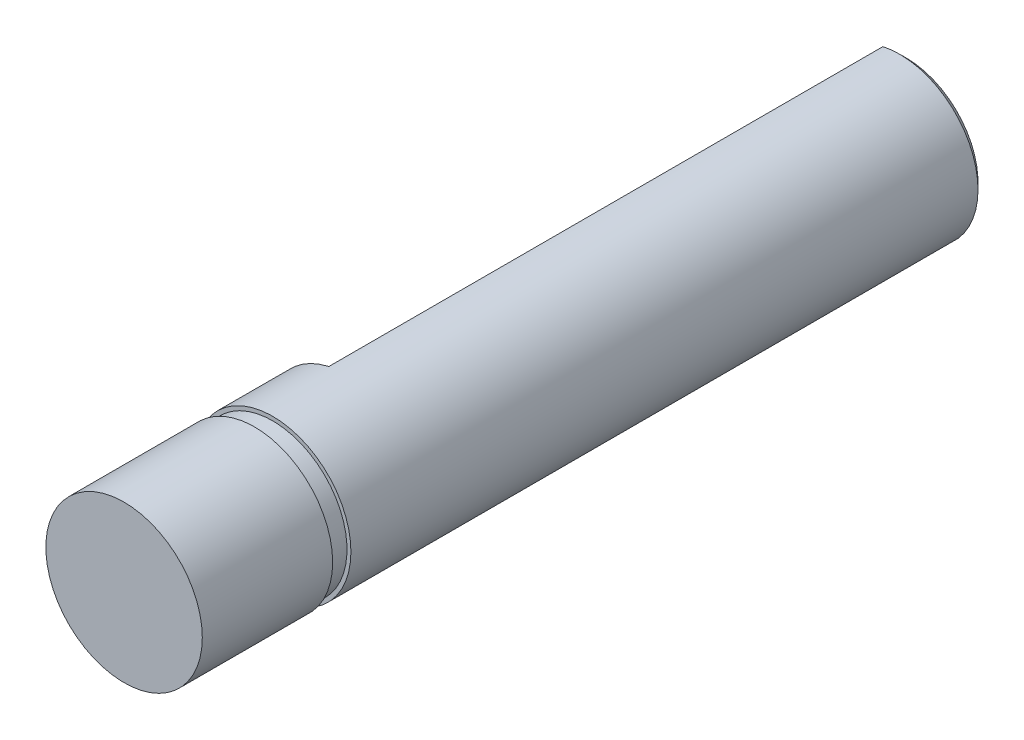
ISO-10303-21;
HEADER;
FILE_DESCRIPTION(('STEP AP214'),'2;1');
FILE_NAME('part.step','',(''),(''),'','','');
FILE_SCHEMA(('AUTOMOTIVE_DESIGN { 1 0 10303 214 1 1 1 1 }'));
ENDSEC;
DATA;
#1=APPLICATION_CONTEXT('core data for automotive mechanical design processes');
#2=APPLICATION_PROTOCOL_DEFINITION('international standard','automotive_design',2000,#1);
#3=PRODUCT_CONTEXT('',#1,'mechanical');
#4=PRODUCT('Part','Part','',(#3));
#5=PRODUCT_RELATED_PRODUCT_CATEGORY('part','',(#4));
#6=PRODUCT_DEFINITION_FORMATION('','',#4);
#7=PRODUCT_DEFINITION_CONTEXT('part definition',#1,'design');
#8=PRODUCT_DEFINITION('design','',#6,#7);
#9=PRODUCT_DEFINITION_SHAPE('','',#8);
#10=(LENGTH_UNIT() NAMED_UNIT(*) SI_UNIT(.MILLI.,.METRE.));
#11=(NAMED_UNIT(*) PLANE_ANGLE_UNIT() SI_UNIT($,.RADIAN.));
#12=(NAMED_UNIT(*) SI_UNIT($,.STERADIAN.) SOLID_ANGLE_UNIT());
#13=UNCERTAINTY_MEASURE_WITH_UNIT(LENGTH_MEASURE(1.E-05),#10,'distance_accuracy_value','');
#14=(GEOMETRIC_REPRESENTATION_CONTEXT(3) GLOBAL_UNCERTAINTY_ASSIGNED_CONTEXT((#13)) GLOBAL_UNIT_ASSIGNED_CONTEXT((#10,
#11,#12)) REPRESENTATION_CONTEXT('',''));
#15=CARTESIAN_POINT('',(0.,0.,0.));
#16=DIRECTION('',(0.,0.,1.));
#17=DIRECTION('',(1.,0.,0.));
#18=AXIS2_PLACEMENT_3D('',#15,#16,#17);
#19=CARTESIAN_POINT('',(0.,0.,-102.5));
#20=DIRECTION('',(0.,0.,-1.));
#21=DIRECTION('',(-1.,0.,0.));
#22=AXIS2_PLACEMENT_3D('',#19,#20,#21);
#23=PLANE('',#22);
#24=CARTESIAN_POINT('',(0.,0.,-102.5));
#25=DIRECTION('',(0.,0.,1.));
#26=DIRECTION('',(1.,0.,0.));
#27=AXIS2_PLACEMENT_3D('',#24,#25,#26);
#28=CIRCLE('',#27,3.);
#29=CARTESIAN_POINT('',(2.99999999999997,0.,-102.5));
#30=VERTEX_POINT('',#29);
#31=EDGE_CURVE('E20',#30,#30,#28,.F.);
#32=ORIENTED_EDGE('',*,*,#31,.F.);
#33=EDGE_LOOP('',(#32));
#34=FACE_BOUND('',#33,.T.);
#35=ADVANCED_FACE('F17',(#34),#23,.F.);
#36=CARTESIAN_POINT('',(0.,0.,-132.5));
#37=DIRECTION('',(0.,0.,1.));
#38=DIRECTION('',(1.,0.,0.));
#39=AXIS2_PLACEMENT_3D('',#36,#37,#38);
#40=CYLINDRICAL_SURFACE('',#39,3.);
#41=ORIENTED_EDGE('',*,*,#31,.T.);
#42=EDGE_LOOP('',(#41));
#43=FACE_BOUND('',#42,.T.);
#44=CARTESIAN_POINT('',(0.,0.,-107.5));
#45=DIRECTION('',(0.,0.,1.));
#46=DIRECTION('',(1.,0.,0.));
#47=AXIS2_PLACEMENT_3D('',#44,#45,#46);
#48=CIRCLE('',#47,3.);
#49=CARTESIAN_POINT('',(2.99999999999997,0.,-107.5));
#50=VERTEX_POINT('',#49);
#51=EDGE_CURVE('E62',#50,#50,#48,.T.);
#52=ORIENTED_EDGE('',*,*,#51,.T.);
#53=EDGE_LOOP('',(#52));
#54=FACE_BOUND('',#53,.T.);
#55=ADVANCED_FACE('F118',(#43,#54),#40,.T.);
#56=CARTESIAN_POINT('',(2.33031200320085,-2.11946832194725,-107.5));
#57=DIRECTION('',(0.,0.,1.));
#58=DIRECTION('',(1.,0.,0.));
#59=AXIS2_PLACEMENT_3D('',#56,#57,#58);
#60=PLANE('',#59);
#61=ORIENTED_EDGE('',*,*,#51,.F.);
#62=EDGE_LOOP('',(#61));
#63=FACE_BOUND('',#62,.T.);
#64=CARTESIAN_POINT('',(0.,0.,-107.5));
#65=DIRECTION('',(0.,0.,-1.));
#66=DIRECTION('',(-1.,0.,0.));
#67=AXIS2_PLACEMENT_3D('',#64,#65,#66);
#68=CIRCLE('',#67,2.85);
#69=CARTESIAN_POINT('',(-2.85000000000003,0.,-107.5));
#70=VERTEX_POINT('',#69);
#71=EDGE_CURVE('E74',#70,#70,#68,.T.);
#72=ORIENTED_EDGE('',*,*,#71,.F.);
#73=EDGE_LOOP('',(#72));
#74=FACE_BOUND('',#73,.T.);
#75=ADVANCED_FACE('F116',(#63,#74),#60,.F.);
#76=CARTESIAN_POINT('',(0.,0.,-132.5));
#77=DIRECTION('',(0.,0.,-1.));
#78=DIRECTION('',(-1.,0.,0.));
#79=AXIS2_PLACEMENT_3D('',#76,#77,#78);
#80=PLANE('',#79);
#81=CARTESIAN_POINT('',(0.,0.,-132.499999999946));
#82=DIRECTION('',(0.,0.,1.));
#83=DIRECTION('',(1.,0.,0.));
#84=AXIS2_PLACEMENT_3D('',#81,#82,#83);
#85=CIRCLE('',#84,2.74999999994777);
#86=CARTESIAN_POINT('',(-1.85032948732419,-2.03439936785928,-132.499999999946));
#87=VERTEX_POINT('',#86);
#88=CARTESIAN_POINT('',(-0.972079149972884,2.57246226906305,-132.499999999973));
#89=VERTEX_POINT('',#88);
#90=EDGE_CURVE('E64',#87,#89,#85,.T.);
#91=ORIENTED_EDGE('',*,*,#90,.F.);
#92=CARTESIAN_POINT('',(0.,0.,-132.499999999946));
#93=DIRECTION('',(0.,0.,1.));
#94=DIRECTION('',(1.,0.,0.));
#95=AXIS2_PLACEMENT_3D('',#92,#93,#94);
#96=CIRCLE('',#95,2.74999999994777);
#97=CARTESIAN_POINT('',(-2.65285063278914,0.724488453890832,-132.499999999947));
#98=VERTEX_POINT('',#97);
#99=EDGE_CURVE('E55',#98,#87,#96,.T.);
#100=ORIENTED_EDGE('',*,*,#99,.F.);
#101=DIRECTION('',(0.67284708633246,0.73978158831774,0.));
#102=VECTOR('',#101,1.);
#103=CARTESIAN_POINT('',(-0.647545238889845,2.92928065633718,-132.5));
#104=LINE('',#103,#102);
#105=EDGE_CURVE('E66',#98,#89,#104,.T.);
#106=ORIENTED_EDGE('',*,*,#105,.T.);
#107=EDGE_LOOP('',(#91,#100,#106));
#108=FACE_BOUND('',#107,.T.);
#109=ADVANCED_FACE('F65',(#108),#80,.T.);
#110=CARTESIAN_POINT('',(0.,0.,-132.250000000056));
#111=DIRECTION('',(0.,0.,1.));
#112=DIRECTION('',(1.,0.,0.));
#113=AXIS2_PLACEMENT_3D('',#110,#111,#112);
#114=CONICAL_SURFACE('',#113,2.99999999990652,0.785398163534279);
#115=CARTESIAN_POINT('',(0.,0.,-132.25));
#116=DIRECTION('',(0.,0.,1.));
#117=DIRECTION('',(1.,0.,0.));
#118=AXIS2_PLACEMENT_3D('',#115,#116,#117);
#119=CIRCLE('',#118,3.);
#120=CARTESIAN_POINT('',(-2.97738454385784,0.36767006669073,-132.249999999991));
#121=VERTEX_POINT('',#120);
#122=CARTESIAN_POINT('',(-2.0185412589603,-2.21934476494245,-132.25));
#123=VERTEX_POINT('',#122);
#124=EDGE_CURVE('E70',#121,#123,#119,.T.);
#125=ORIENTED_EDGE('',*,*,#124,.F.);
#126=CARTESIAN_POINT('',(-2.97738454384852,0.367670066689579,-132.249999999981));
#127=CARTESIAN_POINT('',(-2.96356858378424,0.382860453133743,-132.261849968287));
#128=CARTESIAN_POINT('',(-2.94971166065739,0.398095867891211,-132.273594779029));
#129=CARTESIAN_POINT('',(-2.92210175885005,0.428452355771001,-132.296702466733));
#130=CARTESIAN_POINT('',(-2.90834992488007,0.443572171077555,-132.308068364611));
#131=CARTESIAN_POINT('',(-2.88094585345895,0.473702206939582,-132.330418363165));
#132=CARTESIAN_POINT('',(-2.86729475301831,0.488711178595681,-132.341405539729));
#133=CARTESIAN_POINT('',(-2.84008758041286,0.518624623877265,-132.362997988014));
#134=CARTESIAN_POINT('',(-2.82653263222745,0.533527861950017,-132.373606386399));
#135=CARTESIAN_POINT('',(-2.79951292813588,0.563235250193424,-132.394441247868));
#136=CARTESIAN_POINT('',(-2.78604927797484,0.57803818365218,-132.404670878179));
#137=CARTESIAN_POINT('',(-2.75920704243652,0.607550665281321,-132.424748152372));
#138=CARTESIAN_POINT('',(-2.74582953920497,0.622259021871975,-132.434598993206));
#139=CARTESIAN_POINT('',(-2.71915413455481,0.651588355946804,-132.453918702322));
#140=CARTESIAN_POINT('',(-2.70585728644358,0.666208173586347,-132.463390783286));
#141=CARTESIAN_POINT('',(-2.67933740429471,0.695366599508664,-132.481952821016));
#142=CARTESIAN_POINT('',(-2.66611538898198,0.709904088320241,-132.491045992792));
#143=CARTESIAN_POINT('',(-2.65285063280227,0.724488453841321,-132.499999999947));
#144=B_SPLINE_CURVE_WITH_KNOTS('',3,(#126,#127,#128,#129,#130,#131,#132,#133,#134,#135,#136,
#137,#138,#139,#140,#141,#142,#143),.UNSPECIFIED.,.F.,.F.,(4,2,2,2,2,2,2,2,4),(0.,
0.0711227267520663,0.141279389627747,0.210495347126909,0.278797710095751,0.346215417033072,
0.412779307218857,0.478522190604255,0.543478913259196),.UNSPECIFIED.);
#145=EDGE_CURVE('E59',#121,#98,#144,.T.);
#146=ORIENTED_EDGE('',*,*,#145,.T.);
#147=ORIENTED_EDGE('',*,*,#99,.T.);
#148=DIRECTION('',(0.47577473745339,0.523104577690887,-0.707106781186545));
#149=VECTOR('',#148,1.);
#150=CARTESIAN_POINT('',(-335841.698652629,-369251.068026462,499000.));
#151=LINE('',#150,#149);
#152=EDGE_CURVE('E35',#123,#87,#151,.T.);
#153=ORIENTED_EDGE('',*,*,#152,.F.);
#154=EDGE_LOOP('',(#125,#146,#147,#153));
#155=FACE_BOUND('',#154,.T.);
#156=ADVANCED_FACE('F57',(#155),#114,.T.);
#157=CARTESIAN_POINT('',(0.,0.,-111.));
#158=DIRECTION('',(0.,0.,-1.));
#159=DIRECTION('',(-1.,0.,0.));
#160=AXIS2_PLACEMENT_3D('',#157,#158,#159);
#161=PLANE('',#160);
#162=CARTESIAN_POINT('',(0.,0.,-111.));
#163=DIRECTION('',(0.,0.,1.));
#164=DIRECTION('',(1.,0.,0.));
#165=AXIS2_PLACEMENT_3D('',#162,#163,#164);
#166=CIRCLE('',#165,3.);
#167=CARTESIAN_POINT('',(-0.647545238889842,2.92928065633717,-111.));
#168=VERTEX_POINT('',#167);
#169=CARTESIAN_POINT('',(-2.97738454386715,0.367670066691882,-111.));
#170=VERTEX_POINT('',#169);
#171=EDGE_CURVE('E93',#168,#170,#166,.T.);
#172=ORIENTED_EDGE('',*,*,#171,.F.);
#173=DIRECTION('',(0.67284708633246,0.73978158831774,0.));
#174=VECTOR('',#173,1.);
#175=CARTESIAN_POINT('',(-0.647545238889842,2.92928065633717,-111.));
#176=LINE('',#175,#174);
#177=EDGE_CURVE('E94',#168,#170,#176,.F.);
#178=ORIENTED_EDGE('',*,*,#177,.T.);
#179=EDGE_LOOP('',(#172,#178));
#180=FACE_BOUND('',#179,.T.);
#181=ADVANCED_FACE('F112',(#180),#161,.T.);
#182=CARTESIAN_POINT('',(-0.647545238889842,2.92928065633717,-111.));
#183=DIRECTION('',(0.73978158831774,-0.67284708633246,0.));
#184=DIRECTION('',(0.67284708633246,0.73978158831774,0.));
#185=AXIS2_PLACEMENT_3D('',#182,#183,#184);
#186=PLANE('',#185);
#187=ORIENTED_EDGE('',*,*,#145,.F.);
#188=DIRECTION('',(0.,0.,1.));
#189=VECTOR('',#188,1.);
#190=CARTESIAN_POINT('',(-2.97738454386715,0.367670066691881,-132.5));
#191=LINE('',#190,#189);
#192=EDGE_CURVE('E89',#170,#121,#191,.F.);
#193=ORIENTED_EDGE('',*,*,#192,.F.);
#194=ORIENTED_EDGE('',*,*,#177,.F.);
#195=DIRECTION('',(0.,0.,1.));
#196=VECTOR('',#195,1.);
#197=CARTESIAN_POINT('',(-0.647545238889849,2.92928065633717,-132.5));
#198=LINE('',#197,#196);
#199=CARTESIAN_POINT('',(-0.64754523888602,2.92928065631986,-132.249999999982));
#200=VERTEX_POINT('',#199);
#201=EDGE_CURVE('E85',#200,#168,#198,.T.);
#202=ORIENTED_EDGE('',*,*,#201,.F.);
#203=CARTESIAN_POINT('',(-0.972079149884896,2.57246226912421,-132.499999999947));
#204=CARTESIAN_POINT('',(-0.958814356047904,2.58704660039449,-132.491045992791));
#205=CARTESIAN_POINT('',(-0.945592187599399,2.6015839499251,-132.481952821015));
#206=CARTESIAN_POINT('',(-0.919071948304929,2.63074205101449,-132.463390783284));
#207=CARTESIAN_POINT('',(-0.905774895590574,2.64536168256246,-132.453918702319));
#208=CARTESIAN_POINT('',(-0.879099219062835,2.67469076935754,-132.434598993202));
#209=CARTESIAN_POINT('',(-0.865721650303714,2.68939906634886,-132.424748152368));
#210=CARTESIAN_POINT('',(-0.838879421224855,2.71891155385181,-132.404670878173));
#211=CARTESIAN_POINT('',(-0.825415844825528,2.73371455439784,-132.394441247862));
#212=CARTESIAN_POINT('',(-0.798396362648347,2.76342214447601,-132.373606386392));
#213=CARTESIAN_POINT('',(-0.784841563579069,2.77832551817253,-132.362997988006));
#214=CARTESIAN_POINT('',(-0.757634673368332,2.80823922029713,-132.341405539719));
#215=CARTESIAN_POINT('',(-0.743983705967756,2.82324831295553,-132.330418363155));
#216=CARTESIAN_POINT('',(-0.716579813042809,2.85337851116276,-132.308068364599));
#217=CARTESIAN_POINT('',(-0.702828023314026,2.86849836670721,-132.296702466719));
#218=CARTESIAN_POINT('',(-0.675218154931141,2.89885488498651,-132.273594779014));
#219=CARTESIAN_POINT('',(-0.66136122022101,2.91409028920839,-132.261849968272));
#220=CARTESIAN_POINT('',(-0.647545238882192,2.92928065630254,-132.249999999965));
#221=B_SPLINE_CURVE_WITH_KNOTS('',3,(#203,#204,#205,#206,#207,#208,#209,#210,#211,#212,#213,
#214,#215,#216,#217,#218,#219,#220),.UNSPECIFIED.,.F.,.F.,(4,2,2,2,2,2,2,2,4),(0.,
0.0649567226540956,0.130699606038857,0.19726349622421,0.264681203161307,0.332983566130137,
0.402199523629518,0.472356186505622,0.543478913258365),.UNSPECIFIED.);
#222=EDGE_CURVE('E61',#89,#200,#221,.T.);
#223=ORIENTED_EDGE('',*,*,#222,.F.);
#224=ORIENTED_EDGE('',*,*,#105,.F.);
#225=EDGE_LOOP('',(#187,#193,#194,#202,#223,#224));
#226=FACE_BOUND('',#225,.T.);
#227=ADVANCED_FACE('F145',(#226),#186,.F.);
#228=CARTESIAN_POINT('',(0.,0.,-102.5));
#229=DIRECTION('',(0.,0.,-1.));
#230=DIRECTION('',(-1.,0.,0.));
#231=AXIS2_PLACEMENT_3D('',#228,#229,#230);
#232=CYLINDRICAL_SURFACE('',#231,2.85);
#233=CARTESIAN_POINT('',(0.,0.,-108.2));
#234=DIRECTION('',(0.,0.,-1.));
#235=DIRECTION('',(-1.,0.,0.));
#236=AXIS2_PLACEMENT_3D('',#233,#234,#235);
#237=CIRCLE('',#236,2.85);
#238=CARTESIAN_POINT('',(-2.85000000000003,0.,-108.2));
#239=VERTEX_POINT('',#238);
#240=EDGE_CURVE('E92',#239,#239,#237,.F.);
#241=ORIENTED_EDGE('',*,*,#240,.T.);
#242=EDGE_LOOP('',(#241));
#243=FACE_BOUND('',#242,.T.);
#244=ORIENTED_EDGE('',*,*,#71,.T.);
#245=EDGE_LOOP('',(#244));
#246=FACE_BOUND('',#245,.T.);
#247=ADVANCED_FACE('F143',(#243,#246),#232,.T.);
#248=CARTESIAN_POINT('',(0.,0.,-132.249999999942));
#249=DIRECTION('',(0.,0.,1.));
#250=DIRECTION('',(1.,0.,0.));
#251=AXIS2_PLACEMENT_3D('',#248,#249,#250);
#252=CONICAL_SURFACE('',#251,2.99999999998682,0.785398163467503);
#253=ORIENTED_EDGE('',*,*,#90,.T.);
#254=ORIENTED_EDGE('',*,*,#222,.T.);
#255=CARTESIAN_POINT('',(0.,0.,-132.25));
#256=DIRECTION('',(0.,0.,1.));
#257=DIRECTION('',(1.,0.,0.));
#258=AXIS2_PLACEMENT_3D('',#255,#256,#257);
#259=CIRCLE('',#258,3.);
#260=EDGE_CURVE('E26',#123,#200,#259,.T.);
#261=ORIENTED_EDGE('',*,*,#260,.F.);
#262=ORIENTED_EDGE('',*,*,#152,.T.);
#263=EDGE_LOOP('',(#253,#254,#261,#262));
#264=FACE_BOUND('',#263,.T.);
#265=ADVANCED_FACE('F73',(#264),#252,.T.);
#266=CARTESIAN_POINT('',(2.33031200320085,-2.11946832194725,-108.2));
#267=DIRECTION('',(0.,0.,-1.));
#268=DIRECTION('',(-1.,0.,0.));
#269=AXIS2_PLACEMENT_3D('',#266,#267,#268);
#270=PLANE('',#269);
#271=CARTESIAN_POINT('',(0.,0.,-108.2));
#272=DIRECTION('',(0.,0.,1.));
#273=DIRECTION('',(1.,0.,0.));
#274=AXIS2_PLACEMENT_3D('',#271,#272,#273);
#275=CIRCLE('',#274,3.);
#276=CARTESIAN_POINT('',(2.99999999999997,0.,-108.2));
#277=VERTEX_POINT('',#276);
#278=EDGE_CURVE('E11',#277,#277,#275,.F.);
#279=ORIENTED_EDGE('',*,*,#278,.F.);
#280=EDGE_LOOP('',(#279));
#281=FACE_BOUND('',#280,.T.);
#282=ORIENTED_EDGE('',*,*,#240,.F.);
#283=EDGE_LOOP('',(#282));
#284=FACE_BOUND('',#283,.T.);
#285=ADVANCED_FACE('F131',(#281,#284),#270,.F.);
#286=CARTESIAN_POINT('',(0.,0.,-132.5));
#287=DIRECTION('',(0.,0.,1.));
#288=DIRECTION('',(1.,0.,0.));
#289=AXIS2_PLACEMENT_3D('',#286,#287,#288);
#290=CYLINDRICAL_SURFACE('',#289,3.);
#291=ORIENTED_EDGE('',*,*,#124,.T.);
#292=ORIENTED_EDGE('',*,*,#260,.T.);
#293=ORIENTED_EDGE('',*,*,#201,.T.);
#294=ORIENTED_EDGE('',*,*,#171,.T.);
#295=ORIENTED_EDGE('',*,*,#192,.T.);
#296=EDGE_LOOP('',(#291,#292,#293,#294,#295));
#297=FACE_BOUND('',#296,.T.);
#298=ORIENTED_EDGE('',*,*,#278,.T.);
#299=EDGE_LOOP('',(#298));
#300=FACE_BOUND('',#299,.T.);
#301=ADVANCED_FACE('F129',(#297,#300),#290,.T.);
#302=CLOSED_SHELL('',(#35,#55,#75,#109,#156,#181,#227,#247,#265,#285,#301));
#303=MANIFOLD_SOLID_BREP('B1',#302);
#304=ADVANCED_BREP_SHAPE_REPRESENTATION('',(#18,#303),#14);
#305=SHAPE_DEFINITION_REPRESENTATION(#9,#304);
ENDSEC;
END-ISO-10303-21;
